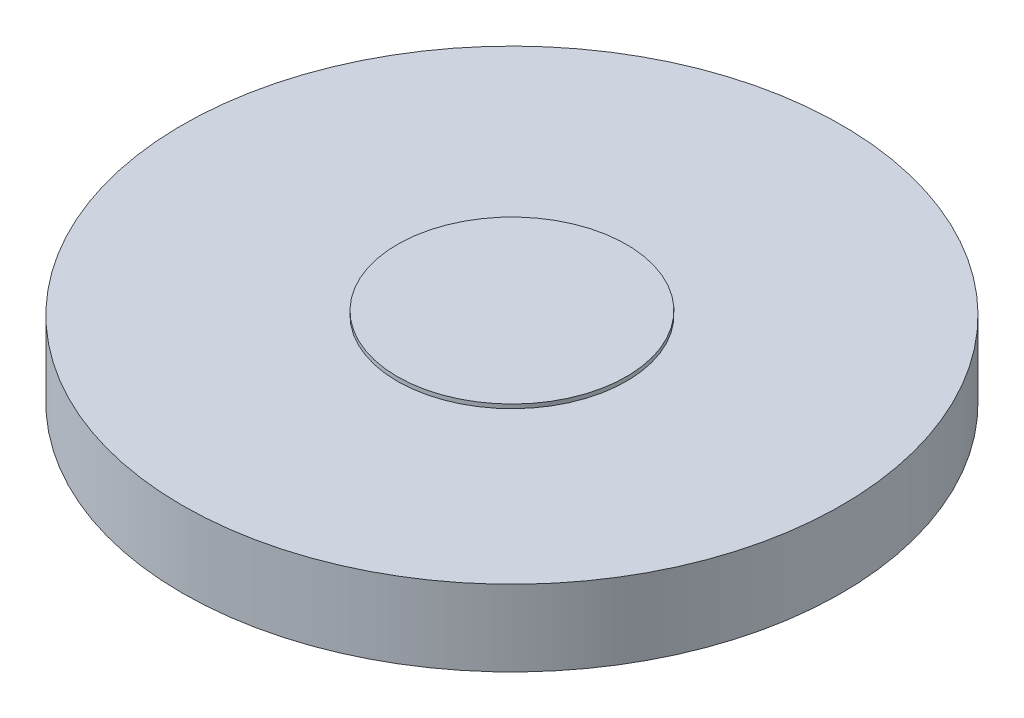
ISO-10303-21;
HEADER;
FILE_DESCRIPTION(('STEP AP214'),'2;1');
FILE_NAME('part.step','',(''),(''),'','','');
FILE_SCHEMA(('AUTOMOTIVE_DESIGN { 1 0 10303 214 1 1 1 1 }'));
ENDSEC;
DATA;
#1=APPLICATION_CONTEXT('core data for automotive mechanical design processes');
#2=APPLICATION_PROTOCOL_DEFINITION('international standard','automotive_design',2000,#1);
#3=PRODUCT_CONTEXT('',#1,'mechanical');
#4=PRODUCT('Part','Part','',(#3));
#5=PRODUCT_RELATED_PRODUCT_CATEGORY('part','',(#4));
#6=PRODUCT_DEFINITION_FORMATION('','',#4);
#7=PRODUCT_DEFINITION_CONTEXT('part definition',#1,'design');
#8=PRODUCT_DEFINITION('design','',#6,#7);
#9=PRODUCT_DEFINITION_SHAPE('','',#8);
#10=(LENGTH_UNIT() NAMED_UNIT(*) SI_UNIT(.MILLI.,.METRE.));
#11=(NAMED_UNIT(*) PLANE_ANGLE_UNIT() SI_UNIT($,.RADIAN.));
#12=(NAMED_UNIT(*) SI_UNIT($,.STERADIAN.) SOLID_ANGLE_UNIT());
#13=UNCERTAINTY_MEASURE_WITH_UNIT(LENGTH_MEASURE(1.E-05),#10,'distance_accuracy_value','');
#14=(GEOMETRIC_REPRESENTATION_CONTEXT(3) GLOBAL_UNCERTAINTY_ASSIGNED_CONTEXT((#13)) GLOBAL_UNIT_ASSIGNED_CONTEXT((#10,
#11,#12)) REPRESENTATION_CONTEXT('',''));
#15=CARTESIAN_POINT('',(0.,0.,0.));
#16=DIRECTION('',(0.,0.,1.));
#17=DIRECTION('',(1.,0.,0.));
#18=AXIS2_PLACEMENT_3D('',#15,#16,#17);
#19=CARTESIAN_POINT('',(0.,2.4003,0.));
#20=DIRECTION('',(0.,-1.,0.));
#21=DIRECTION('',(0.,0.,-1.));
#22=AXIS2_PLACEMENT_3D('',#19,#20,#21);
#23=CYLINDRICAL_SURFACE('',#22,10.414);
#24=CARTESIAN_POINT('',(0.,2.4003,0.));
#25=DIRECTION('',(0.,1.,0.));
#26=DIRECTION('',(0.,0.,1.));
#27=AXIS2_PLACEMENT_3D('',#24,#25,#26);
#28=CIRCLE('',#27,10.414);
#29=CARTESIAN_POINT('',(0.,2.4003,10.414));
#30=VERTEX_POINT('',#29);
#31=EDGE_CURVE('E10',#30,#30,#28,.T.);
#32=ORIENTED_EDGE('',*,*,#31,.F.);
#33=EDGE_LOOP('',(#32));
#34=FACE_BOUND('',#33,.T.);
#35=CARTESIAN_POINT('',(0.,0.,0.));
#36=DIRECTION('',(0.,1.,0.));
#37=DIRECTION('',(0.,0.,1.));
#38=AXIS2_PLACEMENT_3D('',#35,#36,#37);
#39=CIRCLE('',#38,10.414);
#40=CARTESIAN_POINT('',(0.,0.,10.414));
#41=VERTEX_POINT('',#40);
#42=EDGE_CURVE('E38',#41,#41,#39,.T.);
#43=ORIENTED_EDGE('',*,*,#42,.T.);
#44=EDGE_LOOP('',(#43));
#45=FACE_BOUND('',#44,.T.);
#46=ADVANCED_FACE('F31',(#34,#45),#23,.T.);
#47=CARTESIAN_POINT('',(0.,2.4003,0.));
#48=DIRECTION('',(0.,1.,0.));
#49=DIRECTION('',(0.,0.,1.));
#50=AXIS2_PLACEMENT_3D('',#47,#48,#49);
#51=PLANE('',#50);
#52=CARTESIAN_POINT('',(0.,2.4003,0.));
#53=DIRECTION('',(0.,1.,0.));
#54=DIRECTION('',(0.,0.,1.));
#55=AXIS2_PLACEMENT_3D('',#52,#53,#54);
#56=CIRCLE('',#55,3.6195);
#57=CARTESIAN_POINT('',(0.,2.4003,3.6195));
#58=VERTEX_POINT('',#57);
#59=EDGE_CURVE('E48',#58,#58,#56,.T.);
#60=ORIENTED_EDGE('',*,*,#59,.F.);
#61=EDGE_LOOP('',(#60));
#62=FACE_BOUND('',#61,.T.);
#63=ORIENTED_EDGE('',*,*,#31,.T.);
#64=EDGE_LOOP('',(#63));
#65=FACE_BOUND('',#64,.T.);
#66=ADVANCED_FACE('F63',(#62,#65),#51,.T.);
#67=CARTESIAN_POINT('',(0.,0.,0.));
#68=DIRECTION('',(0.,1.,0.));
#69=DIRECTION('',(0.,0.,1.));
#70=AXIS2_PLACEMENT_3D('',#67,#68,#69);
#71=PLANE('',#70);
#72=CARTESIAN_POINT('',(0.,0.,0.));
#73=DIRECTION('',(0.,1.,0.));
#74=DIRECTION('',(0.,0.,1.));
#75=AXIS2_PLACEMENT_3D('',#72,#73,#74);
#76=CIRCLE('',#75,4.2418);
#77=CARTESIAN_POINT('',(0.,0.,4.2418));
#78=VERTEX_POINT('',#77);
#79=EDGE_CURVE('E34',#78,#78,#76,.T.);
#80=ORIENTED_EDGE('',*,*,#79,.T.);
#81=EDGE_LOOP('',(#80));
#82=FACE_BOUND('',#81,.T.);
#83=ORIENTED_EDGE('',*,*,#42,.F.);
#84=EDGE_LOOP('',(#83));
#85=FACE_BOUND('',#84,.T.);
#86=ADVANCED_FACE('F65',(#82,#85),#71,.F.);
#87=CARTESIAN_POINT('',(0.,-3.4417,0.));
#88=DIRECTION('',(0.,1.,0.));
#89=DIRECTION('',(0.,0.,1.));
#90=AXIS2_PLACEMENT_3D('',#87,#88,#89);
#91=CYLINDRICAL_SURFACE('',#90,4.2418);
#92=CARTESIAN_POINT('',(0.,-3.4417,0.));
#93=DIRECTION('',(0.,1.,0.));
#94=DIRECTION('',(0.,0.,1.));
#95=AXIS2_PLACEMENT_3D('',#92,#93,#94);
#96=CIRCLE('',#95,4.2418);
#97=CARTESIAN_POINT('',(0.,-3.4417,4.2418));
#98=VERTEX_POINT('',#97);
#99=EDGE_CURVE('E44',#98,#98,#96,.T.);
#100=ORIENTED_EDGE('',*,*,#99,.T.);
#101=EDGE_LOOP('',(#100));
#102=FACE_BOUND('',#101,.T.);
#103=ORIENTED_EDGE('',*,*,#79,.F.);
#104=EDGE_LOOP('',(#103));
#105=FACE_BOUND('',#104,.T.);
#106=ADVANCED_FACE('F71',(#102,#105),#91,.T.);
#107=CARTESIAN_POINT('',(0.,-3.4417,0.));
#108=DIRECTION('',(0.,1.,0.));
#109=DIRECTION('',(0.,0.,1.));
#110=AXIS2_PLACEMENT_3D('',#107,#108,#109);
#111=PLANE('',#110);
#112=ORIENTED_EDGE('',*,*,#99,.F.);
#113=EDGE_LOOP('',(#112));
#114=FACE_BOUND('',#113,.T.);
#115=ADVANCED_FACE('F59',(#114),#111,.F.);
#116=CARTESIAN_POINT('',(0.,2.5273,0.));
#117=DIRECTION('',(0.,-1.,0.));
#118=DIRECTION('',(0.,0.,-1.));
#119=AXIS2_PLACEMENT_3D('',#116,#117,#118);
#120=CYLINDRICAL_SURFACE('',#119,3.6195);
#121=CARTESIAN_POINT('',(0.,2.5273,0.));
#122=DIRECTION('',(0.,1.,0.));
#123=DIRECTION('',(0.,0.,1.));
#124=AXIS2_PLACEMENT_3D('',#121,#122,#123);
#125=CIRCLE('',#124,3.6195);
#126=CARTESIAN_POINT('',(0.,2.5273,3.6195));
#127=VERTEX_POINT('',#126);
#128=EDGE_CURVE('E47',#127,#127,#125,.T.);
#129=ORIENTED_EDGE('',*,*,#128,.F.);
#130=EDGE_LOOP('',(#129));
#131=FACE_BOUND('',#130,.T.);
#132=ORIENTED_EDGE('',*,*,#59,.T.);
#133=EDGE_LOOP('',(#132));
#134=FACE_BOUND('',#133,.T.);
#135=ADVANCED_FACE('F56',(#131,#134),#120,.T.);
#136=CARTESIAN_POINT('',(0.,2.5273,0.));
#137=DIRECTION('',(0.,1.,0.));
#138=DIRECTION('',(0.,0.,1.));
#139=AXIS2_PLACEMENT_3D('',#136,#137,#138);
#140=PLANE('',#139);
#141=ORIENTED_EDGE('',*,*,#128,.T.);
#142=EDGE_LOOP('',(#141));
#143=FACE_BOUND('',#142,.T.);
#144=ADVANCED_FACE('F54',(#143),#140,.T.);
#145=CLOSED_SHELL('',(#46,#66,#86,#106,#115,#135,#144));
#146=MANIFOLD_SOLID_BREP('B2',#145);
#147=ADVANCED_BREP_SHAPE_REPRESENTATION('',(#18,#146),#14);
#148=SHAPE_DEFINITION_REPRESENTATION(#9,#147);
ENDSEC;
END-ISO-10303-21;
